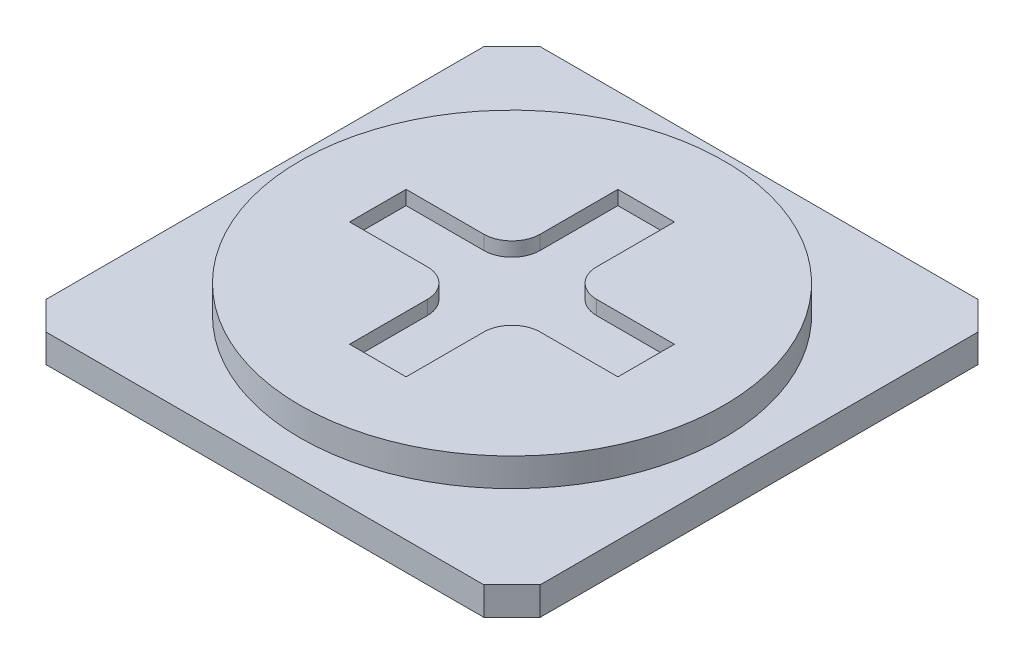
ISO-10303-21;
HEADER;
FILE_DESCRIPTION(('STEP AP214'),'2;1');
FILE_NAME('part.step','',(''),(''),'','','');
FILE_SCHEMA(('AUTOMOTIVE_DESIGN { 1 0 10303 214 1 1 1 1 }'));
ENDSEC;
DATA;
#1=APPLICATION_CONTEXT('core data for automotive mechanical design processes');
#2=APPLICATION_PROTOCOL_DEFINITION('international standard','automotive_design',2000,#1);
#3=PRODUCT_CONTEXT('',#1,'mechanical');
#4=PRODUCT('Part','Part','',(#3));
#5=PRODUCT_RELATED_PRODUCT_CATEGORY('part','',(#4));
#6=PRODUCT_DEFINITION_FORMATION('','',#4);
#7=PRODUCT_DEFINITION_CONTEXT('part definition',#1,'design');
#8=PRODUCT_DEFINITION('design','',#6,#7);
#9=PRODUCT_DEFINITION_SHAPE('','',#8);
#10=(LENGTH_UNIT() NAMED_UNIT(*) SI_UNIT(.MILLI.,.METRE.));
#11=(NAMED_UNIT(*) PLANE_ANGLE_UNIT() SI_UNIT($,.RADIAN.));
#12=(NAMED_UNIT(*) SI_UNIT($,.STERADIAN.) SOLID_ANGLE_UNIT());
#13=UNCERTAINTY_MEASURE_WITH_UNIT(LENGTH_MEASURE(1.E-05),#10,'distance_accuracy_value','');
#14=(GEOMETRIC_REPRESENTATION_CONTEXT(3) GLOBAL_UNCERTAINTY_ASSIGNED_CONTEXT((#13)) GLOBAL_UNIT_ASSIGNED_CONTEXT((#10,
#11,#12)) REPRESENTATION_CONTEXT('',''));
#15=CARTESIAN_POINT('',(0.,0.,0.));
#16=DIRECTION('',(0.,0.,1.));
#17=DIRECTION('',(1.,0.,0.));
#18=AXIS2_PLACEMENT_3D('',#15,#16,#17);
#19=CARTESIAN_POINT('',(1.75,0.2,1.75));
#20=DIRECTION('',(-1.,0.,0.));
#21=DIRECTION('',(0.,0.,1.));
#22=AXIS2_PLACEMENT_3D('',#19,#20,#21);
#23=PLANE('',#22);
#24=DIRECTION('',(0.,0.,-1.));
#25=VECTOR('',#24,1.);
#26=CARTESIAN_POINT('',(1.75,0.,1.75));
#27=LINE('',#26,#25);
#28=CARTESIAN_POINT('',(1.75,0.,1.55));
#29=VERTEX_POINT('',#28);
#30=CARTESIAN_POINT('',(1.75,0.,-1.55));
#31=VERTEX_POINT('',#30);
#32=EDGE_CURVE('P0_E114',#29,#31,#27,.T.);
#33=ORIENTED_EDGE('',*,*,#32,.T.);
#34=DIRECTION('',(0.,1.,0.));
#35=VECTOR('',#34,1.);
#36=CARTESIAN_POINT('',(1.75,0.2,-1.55));
#37=LINE('',#36,#35);
#38=CARTESIAN_POINT('',(1.75,0.2,-1.55));
#39=VERTEX_POINT('',#38);
#40=EDGE_CURVE('P0_E136',#31,#39,#37,.T.);
#41=ORIENTED_EDGE('',*,*,#40,.T.);
#42=DIRECTION('',(0.,0.,-1.));
#43=VECTOR('',#42,1.);
#44=CARTESIAN_POINT('',(1.75,0.2,1.75));
#45=LINE('',#44,#43);
#46=CARTESIAN_POINT('',(1.75,0.2,1.55));
#47=VERTEX_POINT('',#46);
#48=EDGE_CURVE('P0_E112',#47,#39,#45,.T.);
#49=ORIENTED_EDGE('',*,*,#48,.F.);
#50=DIRECTION('',(0.,-1.,0.));
#51=VECTOR('',#50,1.);
#52=CARTESIAN_POINT('',(1.75,0.2,1.55));
#53=LINE('',#52,#51);
#54=EDGE_CURVE('P0_E133',#47,#29,#53,.T.);
#55=ORIENTED_EDGE('',*,*,#54,.T.);
#56=EDGE_LOOP('',(#33,#41,#49,#55));
#57=FACE_BOUND('',#56,.T.);
#58=ADVANCED_FACE('P0_F17',(#57),#23,.F.);
#59=CARTESIAN_POINT('',(-1.75,0.2,-1.75));
#60=DIRECTION('',(0.,0.,1.));
#61=DIRECTION('',(1.,0.,0.));
#62=AXIS2_PLACEMENT_3D('',#59,#60,#61);
#63=PLANE('',#62);
#64=DIRECTION('',(-1.,0.,0.));
#65=VECTOR('',#64,1.);
#66=CARTESIAN_POINT('',(-1.75,0.,-1.75));
#67=LINE('',#66,#65);
#68=CARTESIAN_POINT('',(1.55,0.,-1.75));
#69=VERTEX_POINT('',#68);
#70=CARTESIAN_POINT('',(-1.55,0.,-1.75));
#71=VERTEX_POINT('',#70);
#72=EDGE_CURVE('P0_E110',#69,#71,#67,.T.);
#73=ORIENTED_EDGE('',*,*,#72,.T.);
#74=DIRECTION('',(0.,1.,0.));
#75=VECTOR('',#74,1.);
#76=CARTESIAN_POINT('',(-1.55,0.2,-1.75));
#77=LINE('',#76,#75);
#78=CARTESIAN_POINT('',(-1.55,0.2,-1.75));
#79=VERTEX_POINT('',#78);
#80=EDGE_CURVE('P0_E88',#71,#79,#77,.T.);
#81=ORIENTED_EDGE('',*,*,#80,.T.);
#82=DIRECTION('',(-1.,0.,0.));
#83=VECTOR('',#82,1.);
#84=CARTESIAN_POINT('',(-1.75,0.2,-1.75));
#85=LINE('',#84,#83);
#86=CARTESIAN_POINT('',(1.55,0.2,-1.75));
#87=VERTEX_POINT('',#86);
#88=EDGE_CURVE('P0_E150',#87,#79,#85,.T.);
#89=ORIENTED_EDGE('',*,*,#88,.F.);
#90=DIRECTION('',(0.,-1.,0.));
#91=VECTOR('',#90,1.);
#92=CARTESIAN_POINT('',(1.55,0.2,-1.75));
#93=LINE('',#92,#91);
#94=EDGE_CURVE('P0_E93',#87,#69,#93,.T.);
#95=ORIENTED_EDGE('',*,*,#94,.T.);
#96=EDGE_LOOP('',(#73,#81,#89,#95));
#97=FACE_BOUND('',#96,.T.);
#98=ADVANCED_FACE('P0_F155',(#97),#63,.F.);
#99=CARTESIAN_POINT('',(-1.75,0.2,1.75));
#100=DIRECTION('',(1.,0.,0.));
#101=DIRECTION('',(0.,0.,-1.));
#102=AXIS2_PLACEMENT_3D('',#99,#100,#101);
#103=PLANE('',#102);
#104=DIRECTION('',(0.,0.,1.));
#105=VECTOR('',#104,1.);
#106=CARTESIAN_POINT('',(-1.75,0.2,1.75));
#107=LINE('',#106,#105);
#108=CARTESIAN_POINT('',(-1.75,0.2,-1.55));
#109=VERTEX_POINT('',#108);
#110=CARTESIAN_POINT('',(-1.75,0.2,1.55));
#111=VERTEX_POINT('',#110);
#112=EDGE_CURVE('P0_E102',#109,#111,#107,.T.);
#113=ORIENTED_EDGE('',*,*,#112,.F.);
#114=DIRECTION('',(0.,-1.,0.));
#115=VECTOR('',#114,1.);
#116=CARTESIAN_POINT('',(-1.75,0.2,-1.55));
#117=LINE('',#116,#115);
#118=CARTESIAN_POINT('',(-1.75,0.,-1.55));
#119=VERTEX_POINT('',#118);
#120=EDGE_CURVE('P0_E87',#109,#119,#117,.T.);
#121=ORIENTED_EDGE('',*,*,#120,.T.);
#122=DIRECTION('',(0.,0.,1.));
#123=VECTOR('',#122,1.);
#124=CARTESIAN_POINT('',(-1.75,0.,1.75));
#125=LINE('',#124,#123);
#126=CARTESIAN_POINT('',(-1.75,0.,1.55));
#127=VERTEX_POINT('',#126);
#128=EDGE_CURVE('P0_E100',#119,#127,#125,.T.);
#129=ORIENTED_EDGE('',*,*,#128,.T.);
#130=DIRECTION('',(0.,1.,0.));
#131=VECTOR('',#130,1.);
#132=CARTESIAN_POINT('',(-1.75,0.2,1.55));
#133=LINE('',#132,#131);
#134=EDGE_CURVE('P0_E104',#127,#111,#133,.T.);
#135=ORIENTED_EDGE('',*,*,#134,.T.);
#136=EDGE_LOOP('',(#113,#121,#129,#135));
#137=FACE_BOUND('',#136,.T.);
#138=ADVANCED_FACE('P0_F99',(#137),#103,.F.);
#139=CARTESIAN_POINT('',(-1.75,0.2,1.75));
#140=DIRECTION('',(0.,0.,-1.));
#141=DIRECTION('',(-1.,0.,0.));
#142=AXIS2_PLACEMENT_3D('',#139,#140,#141);
#143=PLANE('',#142);
#144=DIRECTION('',(1.,0.,0.));
#145=VECTOR('',#144,1.);
#146=CARTESIAN_POINT('',(-1.75,0.2,1.75));
#147=LINE('',#146,#145);
#148=CARTESIAN_POINT('',(-1.55,0.2,1.75));
#149=VERTEX_POINT('',#148);
#150=CARTESIAN_POINT('',(1.55,0.2,1.75));
#151=VERTEX_POINT('',#150);
#152=EDGE_CURVE('P0_E118',#149,#151,#147,.T.);
#153=ORIENTED_EDGE('',*,*,#152,.F.);
#154=DIRECTION('',(0.,-1.,0.));
#155=VECTOR('',#154,1.);
#156=CARTESIAN_POINT('',(-1.55,0.2,1.75));
#157=LINE('',#156,#155);
#158=CARTESIAN_POINT('',(-1.55,0.,1.75));
#159=VERTEX_POINT('',#158);
#160=EDGE_CURVE('P0_E11',#149,#159,#157,.T.);
#161=ORIENTED_EDGE('',*,*,#160,.T.);
#162=DIRECTION('',(1.,0.,0.));
#163=VECTOR('',#162,1.);
#164=CARTESIAN_POINT('',(-1.75,0.,1.75));
#165=LINE('',#164,#163);
#166=CARTESIAN_POINT('',(1.55,0.,1.75));
#167=VERTEX_POINT('',#166);
#168=EDGE_CURVE('P0_E109',#159,#167,#165,.T.);
#169=ORIENTED_EDGE('',*,*,#168,.T.);
#170=DIRECTION('',(0.,1.,0.));
#171=VECTOR('',#170,1.);
#172=CARTESIAN_POINT('',(1.55,0.2,1.75));
#173=LINE('',#172,#171);
#174=EDGE_CURVE('P0_E25',#167,#151,#173,.T.);
#175=ORIENTED_EDGE('',*,*,#174,.T.);
#176=EDGE_LOOP('',(#153,#161,#169,#175));
#177=FACE_BOUND('',#176,.T.);
#178=ADVANCED_FACE('P0_F162',(#177),#143,.F.);
#179=CARTESIAN_POINT('',(0.,0.2,0.));
#180=DIRECTION('',(0.,-1.,0.));
#181=DIRECTION('',(0.,0.,-1.));
#182=AXIS2_PLACEMENT_3D('',#179,#180,#181);
#183=PLANE('',#182);
#184=ORIENTED_EDGE('',*,*,#88,.T.);
#185=DIRECTION('',(0.707106781186549,0.,-0.707106781186546));
#186=VECTOR('',#185,1.);
#187=CARTESIAN_POINT('',(-1.75,0.2,-1.55));
#188=LINE('',#187,#186);
#189=EDGE_CURVE('P0_E131',#79,#109,#188,.F.);
#190=ORIENTED_EDGE('',*,*,#189,.T.);
#191=ORIENTED_EDGE('',*,*,#112,.T.);
#192=DIRECTION('',(-0.707106781186546,0.,-0.707106781186549));
#193=VECTOR('',#192,1.);
#194=CARTESIAN_POINT('',(-1.55,0.2,1.75));
#195=LINE('',#194,#193);
#196=EDGE_CURVE('P0_E38',#111,#149,#195,.F.);
#197=ORIENTED_EDGE('',*,*,#196,.T.);
#198=ORIENTED_EDGE('',*,*,#152,.T.);
#199=DIRECTION('',(-0.707106781186549,0.,0.707106781186546));
#200=VECTOR('',#199,1.);
#201=CARTESIAN_POINT('',(1.75,0.2,1.55));
#202=LINE('',#201,#200);
#203=EDGE_CURVE('P0_E126',#151,#47,#202,.F.);
#204=ORIENTED_EDGE('',*,*,#203,.T.);
#205=ORIENTED_EDGE('',*,*,#48,.T.);
#206=DIRECTION('',(0.707106781186546,0.,0.707106781186549));
#207=VECTOR('',#206,1.);
#208=CARTESIAN_POINT('',(1.55,0.2,-1.75));
#209=LINE('',#208,#207);
#210=EDGE_CURVE('P0_E129',#39,#87,#209,.F.);
#211=ORIENTED_EDGE('',*,*,#210,.T.);
#212=EDGE_LOOP('',(#184,#190,#191,#197,#198,#204,#205,#211));
#213=FACE_BOUND('',#212,.T.);
#214=ADVANCED_FACE('P0_F147',(#213),#183,.F.);
#215=CARTESIAN_POINT('',(0.,0.,0.));
#216=DIRECTION('',(0.,-1.,0.));
#217=DIRECTION('',(0.,0.,-1.));
#218=AXIS2_PLACEMENT_3D('',#215,#216,#217);
#219=PLANE('',#218);
#220=ORIENTED_EDGE('',*,*,#128,.F.);
#221=DIRECTION('',(-0.707106781186549,0.,0.707106781186546));
#222=VECTOR('',#221,1.);
#223=CARTESIAN_POINT('',(-1.65,0.,-1.65));
#224=LINE('',#223,#222);
#225=EDGE_CURVE('P0_E83',#119,#71,#224,.F.);
#226=ORIENTED_EDGE('',*,*,#225,.T.);
#227=ORIENTED_EDGE('',*,*,#72,.F.);
#228=DIRECTION('',(-0.707106781186546,0.,-0.707106781186549));
#229=VECTOR('',#228,1.);
#230=CARTESIAN_POINT('',(1.65,0.,-1.65));
#231=LINE('',#230,#229);
#232=EDGE_CURVE('P0_E94',#69,#31,#231,.F.);
#233=ORIENTED_EDGE('',*,*,#232,.T.);
#234=ORIENTED_EDGE('',*,*,#32,.F.);
#235=DIRECTION('',(0.707106781186549,0.,-0.707106781186546));
#236=VECTOR('',#235,1.);
#237=CARTESIAN_POINT('',(1.65,0.,1.65));
#238=LINE('',#237,#236);
#239=EDGE_CURVE('P0_E103',#29,#167,#238,.F.);
#240=ORIENTED_EDGE('',*,*,#239,.T.);
#241=ORIENTED_EDGE('',*,*,#168,.F.);
#242=DIRECTION('',(0.707106781186546,0.,0.707106781186549));
#243=VECTOR('',#242,1.);
#244=CARTESIAN_POINT('',(-1.65,0.,1.65));
#245=LINE('',#244,#243);
#246=EDGE_CURVE('P0_E108',#159,#127,#245,.F.);
#247=ORIENTED_EDGE('',*,*,#246,.T.);
#248=EDGE_LOOP('',(#220,#226,#227,#233,#234,#240,#241,#247));
#249=FACE_BOUND('',#248,.T.);
#250=ADVANCED_FACE('P0_F106',(#249),#219,.T.);
#251=CARTESIAN_POINT('',(-1.75,0.2,-1.55));
#252=DIRECTION('',(0.707106781186546,0.,0.707106781186549));
#253=DIRECTION('',(0.,-1.,0.));
#254=AXIS2_PLACEMENT_3D('',#251,#252,#253);
#255=PLANE('',#254);
#256=ORIENTED_EDGE('',*,*,#189,.F.);
#257=ORIENTED_EDGE('',*,*,#80,.F.);
#258=ORIENTED_EDGE('',*,*,#225,.F.);
#259=ORIENTED_EDGE('',*,*,#120,.F.);
#260=EDGE_LOOP('',(#256,#257,#258,#259));
#261=FACE_BOUND('',#260,.T.);
#262=ADVANCED_FACE('P0_F86',(#261),#255,.F.);
#263=CARTESIAN_POINT('',(1.55,0.2,-1.75));
#264=DIRECTION('',(-0.707106781186549,0.,0.707106781186546));
#265=DIRECTION('',(0.,-1.,0.));
#266=AXIS2_PLACEMENT_3D('',#263,#264,#265);
#267=PLANE('',#266);
#268=ORIENTED_EDGE('',*,*,#210,.F.);
#269=ORIENTED_EDGE('',*,*,#40,.F.);
#270=ORIENTED_EDGE('',*,*,#232,.F.);
#271=ORIENTED_EDGE('',*,*,#94,.F.);
#272=EDGE_LOOP('',(#268,#269,#270,#271));
#273=FACE_BOUND('',#272,.T.);
#274=ADVANCED_FACE('P0_F153',(#273),#267,.F.);
#275=CARTESIAN_POINT('',(-1.55,0.2,1.75));
#276=DIRECTION('',(0.707106781186549,0.,-0.707106781186546));
#277=DIRECTION('',(0.,-1.,0.));
#278=AXIS2_PLACEMENT_3D('',#275,#276,#277);
#279=PLANE('',#278);
#280=ORIENTED_EDGE('',*,*,#196,.F.);
#281=ORIENTED_EDGE('',*,*,#134,.F.);
#282=ORIENTED_EDGE('',*,*,#246,.F.);
#283=ORIENTED_EDGE('',*,*,#160,.F.);
#284=EDGE_LOOP('',(#280,#281,#282,#283));
#285=FACE_BOUND('',#284,.T.);
#286=ADVANCED_FACE('P0_F161',(#285),#279,.F.);
#287=CARTESIAN_POINT('',(1.75,0.2,1.55));
#288=DIRECTION('',(-0.707106781186546,0.,-0.707106781186549));
#289=DIRECTION('',(0.,-1.,0.));
#290=AXIS2_PLACEMENT_3D('',#287,#288,#289);
#291=PLANE('',#290);
#292=ORIENTED_EDGE('',*,*,#203,.F.);
#293=ORIENTED_EDGE('',*,*,#174,.F.);
#294=ORIENTED_EDGE('',*,*,#239,.F.);
#295=ORIENTED_EDGE('',*,*,#54,.F.);
#296=EDGE_LOOP('',(#292,#293,#294,#295));
#297=FACE_BOUND('',#296,.T.);
#298=ADVANCED_FACE('P0_F19',(#297),#291,.F.);
#299=CLOSED_SHELL('',(#58,#98,#138,#178,#214,#250,#262,#274,#286,#298));
#300=MANIFOLD_SOLID_BREP('P0_B1',#299);
#301=CARTESIAN_POINT('',(0.,0.4,0.));
#302=DIRECTION('',(0.,-1.,0.));
#303=DIRECTION('',(0.,0.,-1.));
#304=AXIS2_PLACEMENT_3D('',#301,#302,#303);
#305=CYLINDRICAL_SURFACE('',#304,1.5);
#306=CARTESIAN_POINT('',(0.,0.4,0.));
#307=DIRECTION('',(0.,1.,0.));
#308=DIRECTION('',(0.,0.,1.));
#309=AXIS2_PLACEMENT_3D('',#306,#307,#308);
#310=CIRCLE('',#309,1.5);
#311=CARTESIAN_POINT('',(0.,0.4,1.5));
#312=VERTEX_POINT('',#311);
#313=EDGE_CURVE('P1_E10',#312,#312,#310,.T.);
#314=ORIENTED_EDGE('',*,*,#313,.F.);
#315=EDGE_LOOP('',(#314));
#316=FACE_BOUND('',#315,.T.);
#317=CARTESIAN_POINT('',(0.,0.2,0.));
#318=DIRECTION('',(0.,1.,0.));
#319=DIRECTION('',(0.,0.,1.));
#320=AXIS2_PLACEMENT_3D('',#317,#318,#319);
#321=CIRCLE('',#320,1.5);
#322=CARTESIAN_POINT('',(0.,0.2,1.5));
#323=VERTEX_POINT('',#322);
#324=EDGE_CURVE('P1_E19',#323,#323,#321,.T.);
#325=ORIENTED_EDGE('',*,*,#324,.T.);
#326=EDGE_LOOP('',(#325));
#327=FACE_BOUND('',#326,.T.);
#328=ADVANCED_FACE('P1_F16',(#316,#327),#305,.T.);
#329=CARTESIAN_POINT('',(0.,0.4,0.));
#330=DIRECTION('',(0.,1.,0.));
#331=DIRECTION('',(0.,0.,1.));
#332=AXIS2_PLACEMENT_3D('',#329,#330,#331);
#333=PLANE('',#332);
#334=DIRECTION('',(1.,0.,0.));
#335=VECTOR('',#334,1.);
#336=CARTESIAN_POINT('',(0.4,0.4,0.2));
#337=LINE('',#336,#335);
#338=CARTESIAN_POINT('',(0.4,0.4,0.2));
#339=VERTEX_POINT('',#338);
#340=CARTESIAN_POINT('',(0.95,0.4,0.2));
#341=VERTEX_POINT('',#340);
#342=EDGE_CURVE('P1_E30',#339,#341,#337,.T.);
#343=ORIENTED_EDGE('',*,*,#342,.F.);
#344=CARTESIAN_POINT('',(0.4,0.4,0.4));
#345=DIRECTION('',(0.,-1.,0.));
#346=DIRECTION('',(0.,0.,1.));
#347=AXIS2_PLACEMENT_3D('',#344,#345,#346);
#348=CIRCLE('',#347,0.2);
#349=CARTESIAN_POINT('',(0.2,0.4,0.4));
#350=VERTEX_POINT('',#349);
#351=EDGE_CURVE('P1_E203',#350,#339,#348,.T.);
#352=ORIENTED_EDGE('',*,*,#351,.F.);
#353=DIRECTION('',(0.,0.,-1.));
#354=VECTOR('',#353,1.);
#355=CARTESIAN_POINT('',(0.2,0.4,0.95));
#356=LINE('',#355,#354);
#357=CARTESIAN_POINT('',(0.2,0.4,0.95));
#358=VERTEX_POINT('',#357);
#359=EDGE_CURVE('P1_E201',#358,#350,#356,.T.);
#360=ORIENTED_EDGE('',*,*,#359,.F.);
#361=DIRECTION('',(1.,0.,0.));
#362=VECTOR('',#361,1.);
#363=CARTESIAN_POINT('',(0.2,0.4,0.95));
#364=LINE('',#363,#362);
#365=CARTESIAN_POINT('',(-0.2,0.4,0.95));
#366=VERTEX_POINT('',#365);
#367=EDGE_CURVE('P1_E138',#366,#358,#364,.T.);
#368=ORIENTED_EDGE('',*,*,#367,.F.);
#369=DIRECTION('',(0.,0.,1.));
#370=VECTOR('',#369,1.);
#371=CARTESIAN_POINT('',(-0.2,0.4,0.95));
#372=LINE('',#371,#370);
#373=CARTESIAN_POINT('',(-0.2,0.4,0.4));
#374=VERTEX_POINT('',#373);
#375=EDGE_CURVE('P1_E197',#374,#366,#372,.T.);
#376=ORIENTED_EDGE('',*,*,#375,.F.);
#377=CARTESIAN_POINT('',(-0.4,0.4,0.4));
#378=DIRECTION('',(0.,-1.,0.));
#379=DIRECTION('',(0.,0.,-1.));
#380=AXIS2_PLACEMENT_3D('',#377,#378,#379);
#381=CIRCLE('',#380,0.2);
#382=CARTESIAN_POINT('',(-0.4,0.4,0.2));
#383=VERTEX_POINT('',#382);
#384=EDGE_CURVE('P1_E194',#383,#374,#381,.T.);
#385=ORIENTED_EDGE('',*,*,#384,.F.);
#386=DIRECTION('',(1.,0.,0.));
#387=VECTOR('',#386,1.);
#388=CARTESIAN_POINT('',(-0.4,0.4,0.2));
#389=LINE('',#388,#387);
#390=CARTESIAN_POINT('',(-0.95,0.4,0.2));
#391=VERTEX_POINT('',#390);
#392=EDGE_CURVE('P1_E191',#391,#383,#389,.T.);
#393=ORIENTED_EDGE('',*,*,#392,.F.);
#394=DIRECTION('',(0.,0.,1.));
#395=VECTOR('',#394,1.);
#396=CARTESIAN_POINT('',(-0.95,0.4,-0.2));
#397=LINE('',#396,#395);
#398=CARTESIAN_POINT('',(-0.95,0.4,-0.2));
#399=VERTEX_POINT('',#398);
#400=EDGE_CURVE('P1_E188',#399,#391,#397,.T.);
#401=ORIENTED_EDGE('',*,*,#400,.F.);
#402=DIRECTION('',(-1.,0.,0.));
#403=VECTOR('',#402,1.);
#404=CARTESIAN_POINT('',(-0.4,0.4,-0.2));
#405=LINE('',#404,#403);
#406=CARTESIAN_POINT('',(-0.4,0.4,-0.2));
#407=VERTEX_POINT('',#406);
#408=EDGE_CURVE('P1_E185',#407,#399,#405,.T.);
#409=ORIENTED_EDGE('',*,*,#408,.F.);
#410=CARTESIAN_POINT('',(-0.4,0.4,-0.4));
#411=DIRECTION('',(0.,-1.,0.));
#412=DIRECTION('',(0.,0.,1.));
#413=AXIS2_PLACEMENT_3D('',#410,#411,#412);
#414=CIRCLE('',#413,0.2);
#415=CARTESIAN_POINT('',(-0.2,0.4,-0.4));
#416=VERTEX_POINT('',#415);
#417=EDGE_CURVE('P1_E182',#416,#407,#414,.T.);
#418=ORIENTED_EDGE('',*,*,#417,.F.);
#419=DIRECTION('',(0.,0.,1.));
#420=VECTOR('',#419,1.);
#421=CARTESIAN_POINT('',(-0.2,0.4,-0.95));
#422=LINE('',#421,#420);
#423=CARTESIAN_POINT('',(-0.2,0.4,-0.95));
#424=VERTEX_POINT('',#423);
#425=EDGE_CURVE('P1_E179',#424,#416,#422,.T.);
#426=ORIENTED_EDGE('',*,*,#425,.F.);
#427=DIRECTION('',(-1.,0.,0.));
#428=VECTOR('',#427,1.);
#429=CARTESIAN_POINT('',(0.2,0.4,-0.95));
#430=LINE('',#429,#428);
#431=CARTESIAN_POINT('',(0.2,0.4,-0.95));
#432=VERTEX_POINT('',#431);
#433=EDGE_CURVE('P1_E176',#432,#424,#430,.T.);
#434=ORIENTED_EDGE('',*,*,#433,.F.);
#435=DIRECTION('',(0.,0.,-1.));
#436=VECTOR('',#435,1.);
#437=CARTESIAN_POINT('',(0.2,0.4,-0.95));
#438=LINE('',#437,#436);
#439=CARTESIAN_POINT('',(0.2,0.4,-0.4));
#440=VERTEX_POINT('',#439);
#441=EDGE_CURVE('P1_E173',#440,#432,#438,.T.);
#442=ORIENTED_EDGE('',*,*,#441,.F.);
#443=CARTESIAN_POINT('',(0.4,0.4,-0.4));
#444=DIRECTION('',(0.,-1.,0.));
#445=DIRECTION('',(0.,0.,-1.));
#446=AXIS2_PLACEMENT_3D('',#443,#444,#445);
#447=CIRCLE('',#446,0.2);
#448=CARTESIAN_POINT('',(0.4,0.4,-0.2));
#449=VERTEX_POINT('',#448);
#450=EDGE_CURVE('P1_E170',#449,#440,#447,.T.);
#451=ORIENTED_EDGE('',*,*,#450,.F.);
#452=DIRECTION('',(-1.,0.,0.));
#453=VECTOR('',#452,1.);
#454=CARTESIAN_POINT('',(0.4,0.4,-0.2));
#455=LINE('',#454,#453);
#456=CARTESIAN_POINT('',(0.95,0.4,-0.2));
#457=VERTEX_POINT('',#456);
#458=EDGE_CURVE('P1_E167',#457,#449,#455,.T.);
#459=ORIENTED_EDGE('',*,*,#458,.F.);
#460=DIRECTION('',(0.,0.,-1.));
#461=VECTOR('',#460,1.);
#462=CARTESIAN_POINT('',(0.95,0.4,-0.2));
#463=LINE('',#462,#461);
#464=EDGE_CURVE('P1_E164',#341,#457,#463,.T.);
#465=ORIENTED_EDGE('',*,*,#464,.F.);
#466=EDGE_LOOP('',(#343,#352,#360,#368,#376,#385,#393,#401,#409,#418,#426,#434,#442,#451,#459,#465));
#467=FACE_BOUND('',#466,.T.);
#468=ORIENTED_EDGE('',*,*,#313,.T.);
#469=EDGE_LOOP('',(#468));
#470=FACE_BOUND('',#469,.T.);
#471=ADVANCED_FACE('P1_F238',(#467,#470),#333,.T.);
#472=CARTESIAN_POINT('',(0.,0.2,0.));
#473=DIRECTION('',(0.,1.,0.));
#474=DIRECTION('',(0.,0.,1.));
#475=AXIS2_PLACEMENT_3D('',#472,#473,#474);
#476=PLANE('',#475);
#477=ORIENTED_EDGE('',*,*,#324,.F.);
#478=EDGE_LOOP('',(#477));
#479=FACE_BOUND('',#478,.T.);
#480=ADVANCED_FACE('P1_F295',(#479),#476,.F.);
#481=CARTESIAN_POINT('',(0.4,0.3,0.2));
#482=DIRECTION('',(0.,0.,1.));
#483=DIRECTION('',(1.,0.,0.));
#484=AXIS2_PLACEMENT_3D('',#481,#482,#483);
#485=PLANE('',#484);
#486=ORIENTED_EDGE('',*,*,#342,.T.);
#487=DIRECTION('',(0.,1.,0.));
#488=VECTOR('',#487,1.);
#489=CARTESIAN_POINT('',(0.95,0.3,0.2));
#490=LINE('',#489,#488);
#491=CARTESIAN_POINT('',(0.95,0.3,0.2));
#492=VERTEX_POINT('',#491);
#493=EDGE_CURVE('P1_E90',#492,#341,#490,.T.);
#494=ORIENTED_EDGE('',*,*,#493,.F.);
#495=DIRECTION('',(1.,0.,0.));
#496=VECTOR('',#495,1.);
#497=CARTESIAN_POINT('',(0.4,0.3,0.2));
#498=LINE('',#497,#496);
#499=CARTESIAN_POINT('',(0.4,0.3,0.2));
#500=VERTEX_POINT('',#499);
#501=EDGE_CURVE('P1_E205',#500,#492,#498,.T.);
#502=ORIENTED_EDGE('',*,*,#501,.F.);
#503=DIRECTION('',(0.,1.,0.));
#504=VECTOR('',#503,1.);
#505=CARTESIAN_POINT('',(0.4,0.3,0.2));
#506=LINE('',#505,#504);
#507=EDGE_CURVE('P1_E38',#500,#339,#506,.T.);
#508=ORIENTED_EDGE('',*,*,#507,.T.);
#509=EDGE_LOOP('',(#486,#494,#502,#508));
#510=FACE_BOUND('',#509,.T.);
#511=ADVANCED_FACE('P1_F286',(#510),#485,.F.);
#512=CARTESIAN_POINT('',(0.4,0.3,0.4));
#513=DIRECTION('',(0.,1.,0.));
#514=DIRECTION('',(0.,0.,1.));
#515=AXIS2_PLACEMENT_3D('',#512,#513,#514);
#516=CYLINDRICAL_SURFACE('',#515,0.2);
#517=ORIENTED_EDGE('',*,*,#351,.T.);
#518=ORIENTED_EDGE('',*,*,#507,.F.);
#519=CARTESIAN_POINT('',(0.4,0.3,0.4));
#520=DIRECTION('',(0.,-1.,0.));
#521=DIRECTION('',(0.,0.,1.));
#522=AXIS2_PLACEMENT_3D('',#519,#520,#521);
#523=CIRCLE('',#522,0.2);
#524=CARTESIAN_POINT('',(0.2,0.3,0.4));
#525=VERTEX_POINT('',#524);
#526=EDGE_CURVE('P1_E150',#525,#500,#523,.T.);
#527=ORIENTED_EDGE('',*,*,#526,.F.);
#528=DIRECTION('',(0.,1.,0.));
#529=VECTOR('',#528,1.);
#530=CARTESIAN_POINT('',(0.2,0.3,0.4));
#531=LINE('',#530,#529);
#532=EDGE_CURVE('P1_E142',#525,#350,#531,.T.);
#533=ORIENTED_EDGE('',*,*,#532,.T.);
#534=EDGE_LOOP('',(#517,#518,#527,#533));
#535=FACE_BOUND('',#534,.T.);
#536=ADVANCED_FACE('P1_F284',(#535),#516,.T.);
#537=CARTESIAN_POINT('',(0.2,0.3,0.95));
#538=DIRECTION('',(1.,0.,0.));
#539=DIRECTION('',(0.,0.,-1.));
#540=AXIS2_PLACEMENT_3D('',#537,#538,#539);
#541=PLANE('',#540);
#542=ORIENTED_EDGE('',*,*,#359,.T.);
#543=ORIENTED_EDGE('',*,*,#532,.F.);
#544=DIRECTION('',(0.,0.,-1.));
#545=VECTOR('',#544,1.);
#546=CARTESIAN_POINT('',(0.2,0.3,0.95));
#547=LINE('',#546,#545);
#548=CARTESIAN_POINT('',(0.2,0.3,0.95));
#549=VERTEX_POINT('',#548);
#550=EDGE_CURVE('P1_E146',#549,#525,#547,.T.);
#551=ORIENTED_EDGE('',*,*,#550,.F.);
#552=DIRECTION('',(0.,1.,0.));
#553=VECTOR('',#552,1.);
#554=CARTESIAN_POINT('',(0.2,0.3,0.95));
#555=LINE('',#554,#553);
#556=EDGE_CURVE('P1_E131',#549,#358,#555,.T.);
#557=ORIENTED_EDGE('',*,*,#556,.T.);
#558=EDGE_LOOP('',(#542,#543,#551,#557));
#559=FACE_BOUND('',#558,.T.);
#560=ADVANCED_FACE('P1_F147',(#559),#541,.F.);
#561=CARTESIAN_POINT('',(0.2,0.3,0.95));
#562=DIRECTION('',(0.,0.,1.));
#563=DIRECTION('',(1.,0.,0.));
#564=AXIS2_PLACEMENT_3D('',#561,#562,#563);
#565=PLANE('',#564);
#566=ORIENTED_EDGE('',*,*,#367,.T.);
#567=ORIENTED_EDGE('',*,*,#556,.F.);
#568=DIRECTION('',(1.,0.,0.));
#569=VECTOR('',#568,1.);
#570=CARTESIAN_POINT('',(0.2,0.3,0.95));
#571=LINE('',#570,#569);
#572=CARTESIAN_POINT('',(-0.2,0.3,0.95));
#573=VERTEX_POINT('',#572);
#574=EDGE_CURVE('P1_E135',#573,#549,#571,.T.);
#575=ORIENTED_EDGE('',*,*,#574,.F.);
#576=DIRECTION('',(0.,1.,0.));
#577=VECTOR('',#576,1.);
#578=CARTESIAN_POINT('',(-0.2,0.3,0.95));
#579=LINE('',#578,#577);
#580=EDGE_CURVE('P1_E143',#573,#366,#579,.T.);
#581=ORIENTED_EDGE('',*,*,#580,.T.);
#582=EDGE_LOOP('',(#566,#567,#575,#581));
#583=FACE_BOUND('',#582,.T.);
#584=ADVANCED_FACE('P1_F133',(#583),#565,.F.);
#585=CARTESIAN_POINT('',(-0.2,0.3,0.95));
#586=DIRECTION('',(-1.,0.,0.));
#587=DIRECTION('',(0.,0.,1.));
#588=AXIS2_PLACEMENT_3D('',#585,#586,#587);
#589=PLANE('',#588);
#590=ORIENTED_EDGE('',*,*,#375,.T.);
#591=ORIENTED_EDGE('',*,*,#580,.F.);
#592=DIRECTION('',(0.,0.,1.));
#593=VECTOR('',#592,1.);
#594=CARTESIAN_POINT('',(-0.2,0.3,0.95));
#595=LINE('',#594,#593);
#596=CARTESIAN_POINT('',(-0.2,0.3,0.4));
#597=VERTEX_POINT('',#596);
#598=EDGE_CURVE('P1_E156',#597,#573,#595,.T.);
#599=ORIENTED_EDGE('',*,*,#598,.F.);
#600=DIRECTION('',(0.,1.,0.));
#601=VECTOR('',#600,1.);
#602=CARTESIAN_POINT('',(-0.2,0.3,0.4));
#603=LINE('',#602,#601);
#604=EDGE_CURVE('P1_E209',#597,#374,#603,.T.);
#605=ORIENTED_EDGE('',*,*,#604,.T.);
#606=EDGE_LOOP('',(#590,#591,#599,#605));
#607=FACE_BOUND('',#606,.T.);
#608=ADVANCED_FACE('P1_F283',(#607),#589,.F.);
#609=CARTESIAN_POINT('',(-0.4,0.3,0.4));
#610=DIRECTION('',(0.,1.,0.));
#611=DIRECTION('',(0.,0.,1.));
#612=AXIS2_PLACEMENT_3D('',#609,#610,#611);
#613=CYLINDRICAL_SURFACE('',#612,0.2);
#614=ORIENTED_EDGE('',*,*,#384,.T.);
#615=ORIENTED_EDGE('',*,*,#604,.F.);
#616=CARTESIAN_POINT('',(-0.4,0.3,0.4));
#617=DIRECTION('',(0.,-1.,0.));
#618=DIRECTION('',(0.,0.,-1.));
#619=AXIS2_PLACEMENT_3D('',#616,#617,#618);
#620=CIRCLE('',#619,0.2);
#621=CARTESIAN_POINT('',(-0.4,0.3,0.2));
#622=VERTEX_POINT('',#621);
#623=EDGE_CURVE('P1_E158',#622,#597,#620,.T.);
#624=ORIENTED_EDGE('',*,*,#623,.F.);
#625=DIRECTION('',(0.,1.,0.));
#626=VECTOR('',#625,1.);
#627=CARTESIAN_POINT('',(-0.4,0.3,0.2));
#628=LINE('',#627,#626);
#629=EDGE_CURVE('P1_E211',#622,#383,#628,.T.);
#630=ORIENTED_EDGE('',*,*,#629,.T.);
#631=EDGE_LOOP('',(#614,#615,#624,#630));
#632=FACE_BOUND('',#631,.T.);
#633=ADVANCED_FACE('P1_F279',(#632),#613,.T.);
#634=CARTESIAN_POINT('',(-0.4,0.3,0.2));
#635=DIRECTION('',(0.,0.,1.));
#636=DIRECTION('',(1.,0.,0.));
#637=AXIS2_PLACEMENT_3D('',#634,#635,#636);
#638=PLANE('',#637);
#639=ORIENTED_EDGE('',*,*,#392,.T.);
#640=ORIENTED_EDGE('',*,*,#629,.F.);
#641=DIRECTION('',(1.,0.,0.));
#642=VECTOR('',#641,1.);
#643=CARTESIAN_POINT('',(-0.4,0.3,0.2));
#644=LINE('',#643,#642);
#645=CARTESIAN_POINT('',(-0.95,0.3,0.2));
#646=VERTEX_POINT('',#645);
#647=EDGE_CURVE('P1_E274',#646,#622,#644,.T.);
#648=ORIENTED_EDGE('',*,*,#647,.F.);
#649=DIRECTION('',(0.,1.,0.));
#650=VECTOR('',#649,1.);
#651=CARTESIAN_POINT('',(-0.95,0.3,0.2));
#652=LINE('',#651,#650);
#653=EDGE_CURVE('P1_E213',#646,#391,#652,.T.);
#654=ORIENTED_EDGE('',*,*,#653,.T.);
#655=EDGE_LOOP('',(#639,#640,#648,#654));
#656=FACE_BOUND('',#655,.T.);
#657=ADVANCED_FACE('P1_F346',(#656),#638,.F.);
#658=CARTESIAN_POINT('',(-0.95,0.3,-0.2));
#659=DIRECTION('',(-1.,0.,0.));
#660=DIRECTION('',(0.,0.,1.));
#661=AXIS2_PLACEMENT_3D('',#658,#659,#660);
#662=PLANE('',#661);
#663=ORIENTED_EDGE('',*,*,#400,.T.);
#664=ORIENTED_EDGE('',*,*,#653,.F.);
#665=DIRECTION('',(0.,0.,1.));
#666=VECTOR('',#665,1.);
#667=CARTESIAN_POINT('',(-0.95,0.3,-0.2));
#668=LINE('',#667,#666);
#669=CARTESIAN_POINT('',(-0.95,0.3,-0.2));
#670=VERTEX_POINT('',#669);
#671=EDGE_CURVE('P1_E271',#670,#646,#668,.T.);
#672=ORIENTED_EDGE('',*,*,#671,.F.);
#673=DIRECTION('',(0.,1.,0.));
#674=VECTOR('',#673,1.);
#675=CARTESIAN_POINT('',(-0.95,0.3,-0.2));
#676=LINE('',#675,#674);
#677=EDGE_CURVE('P1_E215',#670,#399,#676,.T.);
#678=ORIENTED_EDGE('',*,*,#677,.T.);
#679=EDGE_LOOP('',(#663,#664,#672,#678));
#680=FACE_BOUND('',#679,.T.);
#681=ADVANCED_FACE('P1_F342',(#680),#662,.F.);
#682=CARTESIAN_POINT('',(-0.4,0.3,-0.2));
#683=DIRECTION('',(0.,0.,-1.));
#684=DIRECTION('',(-1.,0.,0.));
#685=AXIS2_PLACEMENT_3D('',#682,#683,#684);
#686=PLANE('',#685);
#687=ORIENTED_EDGE('',*,*,#408,.T.);
#688=ORIENTED_EDGE('',*,*,#677,.F.);
#689=DIRECTION('',(-1.,0.,0.));
#690=VECTOR('',#689,1.);
#691=CARTESIAN_POINT('',(-0.4,0.3,-0.2));
#692=LINE('',#691,#690);
#693=CARTESIAN_POINT('',(-0.4,0.3,-0.2));
#694=VERTEX_POINT('',#693);
#695=EDGE_CURVE('P1_E268',#694,#670,#692,.T.);
#696=ORIENTED_EDGE('',*,*,#695,.F.);
#697=DIRECTION('',(0.,1.,0.));
#698=VECTOR('',#697,1.);
#699=CARTESIAN_POINT('',(-0.4,0.3,-0.2));
#700=LINE('',#699,#698);
#701=EDGE_CURVE('P1_E217',#694,#407,#700,.T.);
#702=ORIENTED_EDGE('',*,*,#701,.T.);
#703=EDGE_LOOP('',(#687,#688,#696,#702));
#704=FACE_BOUND('',#703,.T.);
#705=ADVANCED_FACE('P1_F338',(#704),#686,.F.);
#706=CARTESIAN_POINT('',(-0.4,0.3,-0.4));
#707=DIRECTION('',(0.,1.,0.));
#708=DIRECTION('',(0.,0.,1.));
#709=AXIS2_PLACEMENT_3D('',#706,#707,#708);
#710=CYLINDRICAL_SURFACE('',#709,0.2);
#711=ORIENTED_EDGE('',*,*,#417,.T.);
#712=ORIENTED_EDGE('',*,*,#701,.F.);
#713=CARTESIAN_POINT('',(-0.4,0.3,-0.4));
#714=DIRECTION('',(0.,-1.,0.));
#715=DIRECTION('',(0.,0.,1.));
#716=AXIS2_PLACEMENT_3D('',#713,#714,#715);
#717=CIRCLE('',#716,0.2);
#718=CARTESIAN_POINT('',(-0.2,0.3,-0.4));
#719=VERTEX_POINT('',#718);
#720=EDGE_CURVE('P1_E265',#719,#694,#717,.T.);
#721=ORIENTED_EDGE('',*,*,#720,.F.);
#722=DIRECTION('',(0.,1.,0.));
#723=VECTOR('',#722,1.);
#724=CARTESIAN_POINT('',(-0.2,0.3,-0.4));
#725=LINE('',#724,#723);
#726=EDGE_CURVE('P1_E219',#719,#416,#725,.T.);
#727=ORIENTED_EDGE('',*,*,#726,.T.);
#728=EDGE_LOOP('',(#711,#712,#721,#727));
#729=FACE_BOUND('',#728,.T.);
#730=ADVANCED_FACE('P1_F334',(#729),#710,.T.);
#731=CARTESIAN_POINT('',(-0.2,0.3,-0.95));
#732=DIRECTION('',(-1.,0.,0.));
#733=DIRECTION('',(0.,0.,1.));
#734=AXIS2_PLACEMENT_3D('',#731,#732,#733);
#735=PLANE('',#734);
#736=ORIENTED_EDGE('',*,*,#425,.T.);
#737=ORIENTED_EDGE('',*,*,#726,.F.);
#738=DIRECTION('',(0.,0.,1.));
#739=VECTOR('',#738,1.);
#740=CARTESIAN_POINT('',(-0.2,0.3,-0.95));
#741=LINE('',#740,#739);
#742=CARTESIAN_POINT('',(-0.2,0.3,-0.95));
#743=VERTEX_POINT('',#742);
#744=EDGE_CURVE('P1_E262',#743,#719,#741,.T.);
#745=ORIENTED_EDGE('',*,*,#744,.F.);
#746=DIRECTION('',(0.,1.,0.));
#747=VECTOR('',#746,1.);
#748=CARTESIAN_POINT('',(-0.2,0.3,-0.95));
#749=LINE('',#748,#747);
#750=EDGE_CURVE('P1_E221',#743,#424,#749,.T.);
#751=ORIENTED_EDGE('',*,*,#750,.T.);
#752=EDGE_LOOP('',(#736,#737,#745,#751));
#753=FACE_BOUND('',#752,.T.);
#754=ADVANCED_FACE('P1_F330',(#753),#735,.F.);
#755=CARTESIAN_POINT('',(0.2,0.3,-0.95));
#756=DIRECTION('',(0.,0.,-1.));
#757=DIRECTION('',(-1.,0.,0.));
#758=AXIS2_PLACEMENT_3D('',#755,#756,#757);
#759=PLANE('',#758);
#760=ORIENTED_EDGE('',*,*,#433,.T.);
#761=ORIENTED_EDGE('',*,*,#750,.F.);
#762=DIRECTION('',(-1.,0.,0.));
#763=VECTOR('',#762,1.);
#764=CARTESIAN_POINT('',(0.2,0.3,-0.95));
#765=LINE('',#764,#763);
#766=CARTESIAN_POINT('',(0.2,0.3,-0.95));
#767=VERTEX_POINT('',#766);
#768=EDGE_CURVE('P1_E259',#767,#743,#765,.T.);
#769=ORIENTED_EDGE('',*,*,#768,.F.);
#770=DIRECTION('',(0.,1.,0.));
#771=VECTOR('',#770,1.);
#772=CARTESIAN_POINT('',(0.2,0.3,-0.95));
#773=LINE('',#772,#771);
#774=EDGE_CURVE('P1_E223',#767,#432,#773,.T.);
#775=ORIENTED_EDGE('',*,*,#774,.T.);
#776=EDGE_LOOP('',(#760,#761,#769,#775));
#777=FACE_BOUND('',#776,.T.);
#778=ADVANCED_FACE('P1_F326',(#777),#759,.F.);
#779=CARTESIAN_POINT('',(0.2,0.3,-0.95));
#780=DIRECTION('',(1.,0.,0.));
#781=DIRECTION('',(0.,0.,-1.));
#782=AXIS2_PLACEMENT_3D('',#779,#780,#781);
#783=PLANE('',#782);
#784=ORIENTED_EDGE('',*,*,#441,.T.);
#785=ORIENTED_EDGE('',*,*,#774,.F.);
#786=DIRECTION('',(0.,0.,-1.));
#787=VECTOR('',#786,1.);
#788=CARTESIAN_POINT('',(0.2,0.3,-0.95));
#789=LINE('',#788,#787);
#790=CARTESIAN_POINT('',(0.2,0.3,-0.4));
#791=VERTEX_POINT('',#790);
#792=EDGE_CURVE('P1_E256',#791,#767,#789,.T.);
#793=ORIENTED_EDGE('',*,*,#792,.F.);
#794=DIRECTION('',(0.,1.,0.));
#795=VECTOR('',#794,1.);
#796=CARTESIAN_POINT('',(0.2,0.3,-0.4));
#797=LINE('',#796,#795);
#798=EDGE_CURVE('P1_E225',#791,#440,#797,.T.);
#799=ORIENTED_EDGE('',*,*,#798,.T.);
#800=EDGE_LOOP('',(#784,#785,#793,#799));
#801=FACE_BOUND('',#800,.T.);
#802=ADVANCED_FACE('P1_F322',(#801),#783,.F.);
#803=CARTESIAN_POINT('',(0.4,0.3,-0.4));
#804=DIRECTION('',(0.,1.,0.));
#805=DIRECTION('',(0.,0.,1.));
#806=AXIS2_PLACEMENT_3D('',#803,#804,#805);
#807=CYLINDRICAL_SURFACE('',#806,0.2);
#808=ORIENTED_EDGE('',*,*,#450,.T.);
#809=ORIENTED_EDGE('',*,*,#798,.F.);
#810=CARTESIAN_POINT('',(0.4,0.3,-0.4));
#811=DIRECTION('',(0.,-1.,0.));
#812=DIRECTION('',(0.,0.,-1.));
#813=AXIS2_PLACEMENT_3D('',#810,#811,#812);
#814=CIRCLE('',#813,0.2);
#815=CARTESIAN_POINT('',(0.4,0.3,-0.2));
#816=VERTEX_POINT('',#815);
#817=EDGE_CURVE('P1_E250',#816,#791,#814,.T.);
#818=ORIENTED_EDGE('',*,*,#817,.F.);
#819=DIRECTION('',(0.,1.,0.));
#820=VECTOR('',#819,1.);
#821=CARTESIAN_POINT('',(0.4,0.3,-0.2));
#822=LINE('',#821,#820);
#823=EDGE_CURVE('P1_E227',#816,#449,#822,.T.);
#824=ORIENTED_EDGE('',*,*,#823,.T.);
#825=EDGE_LOOP('',(#808,#809,#818,#824));
#826=FACE_BOUND('',#825,.T.);
#827=ADVANCED_FACE('P1_F319',(#826),#807,.T.);
#828=CARTESIAN_POINT('',(0.4,0.3,-0.2));
#829=DIRECTION('',(0.,0.,-1.));
#830=DIRECTION('',(-1.,0.,0.));
#831=AXIS2_PLACEMENT_3D('',#828,#829,#830);
#832=PLANE('',#831);
#833=ORIENTED_EDGE('',*,*,#458,.T.);
#834=ORIENTED_EDGE('',*,*,#823,.F.);
#835=DIRECTION('',(-1.,0.,0.));
#836=VECTOR('',#835,1.);
#837=CARTESIAN_POINT('',(0.4,0.3,-0.2));
#838=LINE('',#837,#836);
#839=CARTESIAN_POINT('',(0.95,0.3,-0.2));
#840=VERTEX_POINT('',#839);
#841=EDGE_CURVE('P1_E248',#840,#816,#838,.T.);
#842=ORIENTED_EDGE('',*,*,#841,.F.);
#843=DIRECTION('',(0.,1.,0.));
#844=VECTOR('',#843,1.);
#845=CARTESIAN_POINT('',(0.95,0.3,-0.2));
#846=LINE('',#845,#844);
#847=EDGE_CURVE('P1_E229',#840,#457,#846,.T.);
#848=ORIENTED_EDGE('',*,*,#847,.T.);
#849=EDGE_LOOP('',(#833,#834,#842,#848));
#850=FACE_BOUND('',#849,.T.);
#851=ADVANCED_FACE('P1_F244',(#850),#832,.F.);
#852=CARTESIAN_POINT('',(0.95,0.3,-0.2));
#853=DIRECTION('',(1.,0.,0.));
#854=DIRECTION('',(0.,0.,-1.));
#855=AXIS2_PLACEMENT_3D('',#852,#853,#854);
#856=PLANE('',#855);
#857=ORIENTED_EDGE('',*,*,#464,.T.);
#858=ORIENTED_EDGE('',*,*,#847,.F.);
#859=DIRECTION('',(0.,0.,-1.));
#860=VECTOR('',#859,1.);
#861=CARTESIAN_POINT('',(0.95,0.3,-0.2));
#862=LINE('',#861,#860);
#863=EDGE_CURVE('P1_E236',#492,#840,#862,.T.);
#864=ORIENTED_EDGE('',*,*,#863,.F.);
#865=ORIENTED_EDGE('',*,*,#493,.T.);
#866=EDGE_LOOP('',(#857,#858,#864,#865));
#867=FACE_BOUND('',#866,.T.);
#868=ADVANCED_FACE('P1_F233',(#867),#856,.F.);
#869=CARTESIAN_POINT('',(0.4,0.3,-0.4));
#870=DIRECTION('',(0.,-1.,0.));
#871=DIRECTION('',(0.,0.,-1.));
#872=AXIS2_PLACEMENT_3D('',#869,#870,#871);
#873=PLANE('',#872);
#874=ORIENTED_EDGE('',*,*,#501,.T.);
#875=ORIENTED_EDGE('',*,*,#863,.T.);
#876=ORIENTED_EDGE('',*,*,#841,.T.);
#877=ORIENTED_EDGE('',*,*,#817,.T.);
#878=ORIENTED_EDGE('',*,*,#792,.T.);
#879=ORIENTED_EDGE('',*,*,#768,.T.);
#880=ORIENTED_EDGE('',*,*,#744,.T.);
#881=ORIENTED_EDGE('',*,*,#720,.T.);
#882=ORIENTED_EDGE('',*,*,#695,.T.);
#883=ORIENTED_EDGE('',*,*,#671,.T.);
#884=ORIENTED_EDGE('',*,*,#647,.T.);
#885=ORIENTED_EDGE('',*,*,#623,.T.);
#886=ORIENTED_EDGE('',*,*,#598,.T.);
#887=ORIENTED_EDGE('',*,*,#574,.T.);
#888=ORIENTED_EDGE('',*,*,#550,.T.);
#889=ORIENTED_EDGE('',*,*,#526,.T.);
#890=EDGE_LOOP('',(#874,#875,#876,#877,#878,#879,#880,#881,#882,#883,#884,#885,#886,#887,#888,#889));
#891=FACE_BOUND('',#890,.T.);
#892=ADVANCED_FACE('P1_F153',(#891),#873,.F.);
#893=CLOSED_SHELL('',(#328,#471,#480,#511,#536,#560,#584,#608,#633,#657,#681,#705,#730,#754,
#778,#802,#827,#851,#868,#892));
#894=MANIFOLD_SOLID_BREP('P1_B1',#893);
#895=ADVANCED_BREP_SHAPE_REPRESENTATION('',(#18,#300,#894),#14);
#896=SHAPE_DEFINITION_REPRESENTATION(#9,#895);
ENDSEC;
END-ISO-10303-21;
